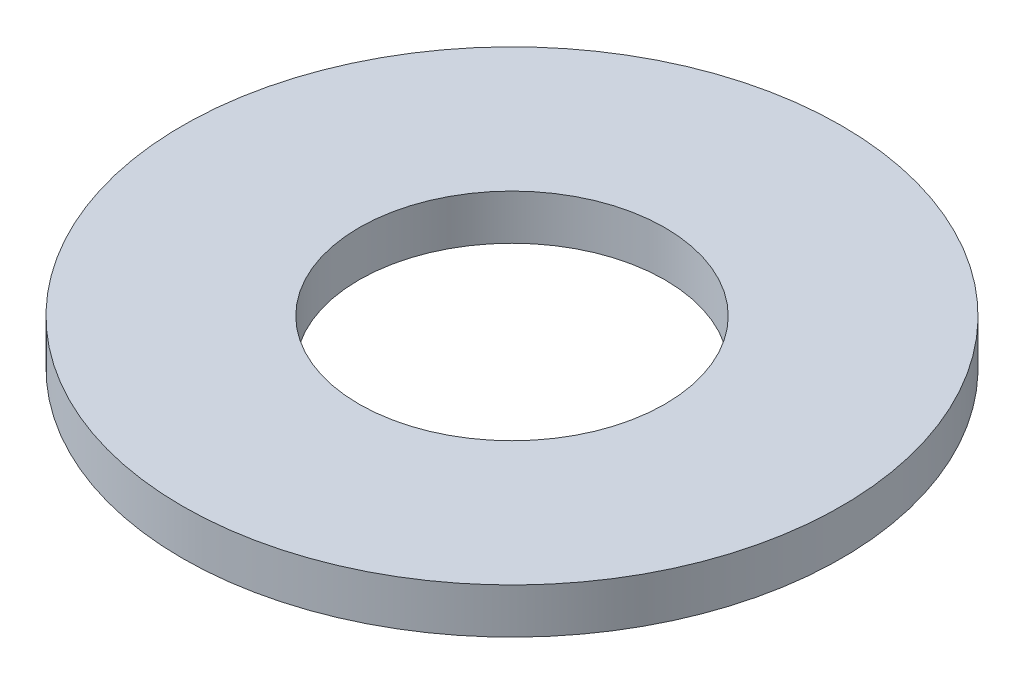
ISO-10303-21;
HEADER;
FILE_DESCRIPTION(('STEP AP214'),'2;1');
FILE_NAME('part.step','',(''),(''),'','','');
FILE_SCHEMA(('AUTOMOTIVE_DESIGN { 1 0 10303 214 1 1 1 1 }'));
ENDSEC;
DATA;
#1=APPLICATION_CONTEXT('core data for automotive mechanical design processes');
#2=APPLICATION_PROTOCOL_DEFINITION('international standard','automotive_design',2000,#1);
#3=PRODUCT_CONTEXT('',#1,'mechanical');
#4=PRODUCT('Part','Part','',(#3));
#5=PRODUCT_RELATED_PRODUCT_CATEGORY('part','',(#4));
#6=PRODUCT_DEFINITION_FORMATION('','',#4);
#7=PRODUCT_DEFINITION_CONTEXT('part definition',#1,'design');
#8=PRODUCT_DEFINITION('design','',#6,#7);
#9=PRODUCT_DEFINITION_SHAPE('','',#8);
#10=(LENGTH_UNIT() NAMED_UNIT(*) SI_UNIT(.MILLI.,.METRE.));
#11=(NAMED_UNIT(*) PLANE_ANGLE_UNIT() SI_UNIT($,.RADIAN.));
#12=(NAMED_UNIT(*) SI_UNIT($,.STERADIAN.) SOLID_ANGLE_UNIT());
#13=UNCERTAINTY_MEASURE_WITH_UNIT(LENGTH_MEASURE(1.E-05),#10,'distance_accuracy_value','');
#14=(GEOMETRIC_REPRESENTATION_CONTEXT(3) GLOBAL_UNCERTAINTY_ASSIGNED_CONTEXT((#13)) GLOBAL_UNIT_ASSIGNED_CONTEXT((#10,
#11,#12)) REPRESENTATION_CONTEXT('',''));
#15=CARTESIAN_POINT('',(0.,0.,0.));
#16=DIRECTION('',(0.,0.,1.));
#17=DIRECTION('',(1.,0.,0.));
#18=AXIS2_PLACEMENT_3D('',#15,#16,#17);
#19=CARTESIAN_POINT('',(0.,1.524,0.));
#20=DIRECTION('',(0.,-1.,0.));
#21=DIRECTION('',(0.,0.,1.));
#22=AXIS2_PLACEMENT_3D('',#19,#20,#21);
#23=CYLINDRICAL_SURFACE('',#22,11.1125);
#24=CARTESIAN_POINT('',(0.,1.524,0.));
#25=DIRECTION('',(0.,-1.,0.));
#26=DIRECTION('',(0.,0.,-1.));
#27=AXIS2_PLACEMENT_3D('',#24,#25,#26);
#28=CIRCLE('',#27,11.1125);
#29=CARTESIAN_POINT('',(0.,1.524,11.1125));
#30=VERTEX_POINT('',#29);
#31=EDGE_CURVE('E10',#30,#30,#28,.T.);
#32=CARTESIAN_POINT('',(0.,0.,0.));
#33=DIRECTION('',(0.,-1.,0.));
#34=DIRECTION('',(0.,0.,-1.));
#35=AXIS2_PLACEMENT_3D('',#32,#33,#34);
#36=CIRCLE('',#35,11.1125);
#37=CARTESIAN_POINT('',(0.,0.,11.1125));
#38=VERTEX_POINT('',#37);
#39=EDGE_CURVE('E46',#38,#38,#36,.T.);
#40=CARTESIAN_POINT('',(0.,1.524,11.1125));
#41=CARTESIAN_POINT('',(0.,1.508125,11.1125));
#42=CARTESIAN_POINT('',(0.,1.49225,11.1125));
#43=CARTESIAN_POINT('',(0.,1.4605,11.1125));
#44=CARTESIAN_POINT('',(0.,1.444625,11.1125));
#45=CARTESIAN_POINT('',(0.,1.412875,11.1125));
#46=CARTESIAN_POINT('',(0.,1.397,11.1125));
#47=CARTESIAN_POINT('',(0.,1.36525,11.1125));
#48=CARTESIAN_POINT('',(0.,1.349375,11.1125));
#49=CARTESIAN_POINT('',(0.,1.317625,11.1125));
#50=CARTESIAN_POINT('',(0.,1.30175,11.1125));
#51=CARTESIAN_POINT('',(0.,1.27,11.1125));
#52=CARTESIAN_POINT('',(0.,1.254125,11.1125));
#53=CARTESIAN_POINT('',(0.,1.222375,11.1125));
#54=CARTESIAN_POINT('',(0.,1.2065,11.1125));
#55=CARTESIAN_POINT('',(0.,1.17475,11.1125));
#56=CARTESIAN_POINT('',(0.,1.158875,11.1125));
#57=CARTESIAN_POINT('',(0.,1.127125,11.1125));
#58=CARTESIAN_POINT('',(0.,1.11125,11.1125));
#59=CARTESIAN_POINT('',(0.,1.0795,11.1125));
#60=CARTESIAN_POINT('',(0.,1.063625,11.1125));
#61=CARTESIAN_POINT('',(0.,1.031875,11.1125));
#62=CARTESIAN_POINT('',(0.,1.016,11.1125));
#63=CARTESIAN_POINT('',(0.,0.98425,11.1125));
#64=CARTESIAN_POINT('',(0.,0.968375,11.1125));
#65=CARTESIAN_POINT('',(0.,0.936625,11.1125));
#66=CARTESIAN_POINT('',(0.,0.92075,11.1125));
#67=CARTESIAN_POINT('',(0.,0.889,11.1125));
#68=CARTESIAN_POINT('',(0.,0.873125,11.1125));
#69=CARTESIAN_POINT('',(0.,0.841375,11.1125));
#70=CARTESIAN_POINT('',(0.,0.8255,11.1125));
#71=CARTESIAN_POINT('',(0.,0.79375,11.1125));
#72=CARTESIAN_POINT('',(0.,0.777875,11.1125));
#73=CARTESIAN_POINT('',(0.,0.746125,11.1125));
#74=CARTESIAN_POINT('',(0.,0.73025,11.1125));
#75=CARTESIAN_POINT('',(0.,0.6985,11.1125));
#76=CARTESIAN_POINT('',(0.,0.682625,11.1125));
#77=CARTESIAN_POINT('',(0.,0.650875,11.1125));
#78=CARTESIAN_POINT('',(0.,0.635,11.1125));
#79=CARTESIAN_POINT('',(0.,0.60325,11.1125));
#80=CARTESIAN_POINT('',(0.,0.587375,11.1125));
#81=CARTESIAN_POINT('',(0.,0.555625,11.1125));
#82=CARTESIAN_POINT('',(0.,0.53975,11.1125));
#83=CARTESIAN_POINT('',(0.,0.508,11.1125));
#84=CARTESIAN_POINT('',(0.,0.492125,11.1125));
#85=CARTESIAN_POINT('',(0.,0.460375,11.1125));
#86=CARTESIAN_POINT('',(0.,0.4445,11.1125));
#87=CARTESIAN_POINT('',(0.,0.41275,11.1125));
#88=CARTESIAN_POINT('',(0.,0.396875,11.1125));
#89=CARTESIAN_POINT('',(0.,0.365125,11.1125));
#90=CARTESIAN_POINT('',(0.,0.34925,11.1125));
#91=CARTESIAN_POINT('',(0.,0.3175,11.1125));
#92=CARTESIAN_POINT('',(0.,0.301625,11.1125));
#93=CARTESIAN_POINT('',(0.,0.269875,11.1125));
#94=CARTESIAN_POINT('',(0.,0.254,11.1125));
#95=CARTESIAN_POINT('',(0.,0.22225,11.1125));
#96=CARTESIAN_POINT('',(0.,0.206375,11.1125));
#97=CARTESIAN_POINT('',(0.,0.174625,11.1125));
#98=CARTESIAN_POINT('',(0.,0.15875,11.1125));
#99=CARTESIAN_POINT('',(0.,0.127,11.1125));
#100=CARTESIAN_POINT('',(0.,0.111125,11.1125));
#101=CARTESIAN_POINT('',(0.,0.079375,11.1125));
#102=CARTESIAN_POINT('',(0.,0.0635,11.1125));
#103=CARTESIAN_POINT('',(0.,0.0317499999999999,11.1125));
#104=CARTESIAN_POINT('',(0.,0.015875,11.1125));
#105=CARTESIAN_POINT('',(0.,0.,11.1125));
#106=B_SPLINE_CURVE_WITH_KNOTS('',3,(#40,#41,#42,#43,#44,#45,#46,#47,#48,#49,#50,#51,#52,#53,
#54,#55,#56,#57,#58,#59,#60,#61,#62,#63,#64,#65,#66,#67,#68,#69,#70,#71,#72,#73,#74,#75,#76,#77,
#78,#79,#80,#81,#82,#83,#84,#85,#86,#87,#88,#89,#90,#91,#92,#93,#94,#95,#96,#97,#98,#99,#100,
#101,#102,#103,#104,#105),.UNSPECIFIED.,.F.,.F.,(4,2,2,2,2,2,2,2,2,2,2,2,2,2,2,2,2,2,2,2,2,2,2,
2,2,2,2,2,2,2,2,2,4),(0.,0.0476249999999999,0.0952499999999998,0.142875,0.1905,0.238125,0.28575,
0.333375,0.381,0.428625,0.47625,0.523875,0.5715,0.619125,0.66675,0.714375,0.762,0.809625,
0.85725,0.904875,0.9525,1.000125,1.04775,1.095375,1.143,1.190625,1.23825,1.285875,1.3335,
1.381125,1.42875,1.476375,1.524),.UNSPECIFIED.);
#107=EDGE_CURVE('BSEAM43',#30,#38,#106,.T.);
#108=ORIENTED_EDGE('',*,*,#31,.T.);
#109=ORIENTED_EDGE('',*,*,#39,.F.);
#110=ORIENTED_EDGE('',*,*,#107,.T.);
#111=ORIENTED_EDGE('',*,*,#107,.F.);
#112=EDGE_LOOP('',(#108,#110,#109,#111));
#113=FACE_BOUND('',#112,.T.);
#114=ADVANCED_FACE('F43',(#113),#23,.T.);
#115=CARTESIAN_POINT('',(0.,1.524,0.));
#116=DIRECTION('',(0.,1.,0.));
#117=DIRECTION('',(0.,0.,-1.));
#118=AXIS2_PLACEMENT_3D('',#115,#116,#117);
#119=PLANE('',#118);
#120=CARTESIAN_POINT('',(0.,1.524,0.));
#121=DIRECTION('',(0.,-1.,0.));
#122=DIRECTION('',(0.,0.,-1.));
#123=AXIS2_PLACEMENT_3D('',#120,#121,#122);
#124=CIRCLE('',#123,5.1562);
#125=CARTESIAN_POINT('',(0.,1.524,-5.1562));
#126=VERTEX_POINT('',#125);
#127=EDGE_CURVE('E55',#126,#126,#124,.T.);
#128=ORIENTED_EDGE('',*,*,#127,.T.);
#129=EDGE_LOOP('',(#128));
#130=FACE_BOUND('',#129,.T.);
#131=ORIENTED_EDGE('',*,*,#31,.F.);
#132=EDGE_LOOP('',(#131));
#133=FACE_BOUND('',#132,.T.);
#134=ADVANCED_FACE('F67',(#130,#133),#119,.T.);
#135=CARTESIAN_POINT('',(0.,0.,0.));
#136=DIRECTION('',(0.,1.,0.));
#137=DIRECTION('',(0.,0.,-1.));
#138=AXIS2_PLACEMENT_3D('',#135,#136,#137);
#139=PLANE('',#138);
#140=CARTESIAN_POINT('',(0.,0.,0.));
#141=DIRECTION('',(0.,-1.,0.));
#142=DIRECTION('',(0.,0.,-1.));
#143=AXIS2_PLACEMENT_3D('',#140,#141,#142);
#144=CIRCLE('',#143,5.1562);
#145=CARTESIAN_POINT('',(0.,0.,-5.1562));
#146=VERTEX_POINT('',#145);
#147=EDGE_CURVE('E53',#146,#146,#144,.T.);
#148=ORIENTED_EDGE('',*,*,#147,.F.);
#149=EDGE_LOOP('',(#148));
#150=FACE_BOUND('',#149,.T.);
#151=ORIENTED_EDGE('',*,*,#39,.T.);
#152=EDGE_LOOP('',(#151));
#153=FACE_BOUND('',#152,.T.);
#154=ADVANCED_FACE('F64',(#150,#153),#139,.F.);
#155=CARTESIAN_POINT('',(0.,0.,0.));
#156=DIRECTION('',(0.,1.,0.));
#157=DIRECTION('',(0.,0.,-1.));
#158=AXIS2_PLACEMENT_3D('',#155,#156,#157);
#159=CYLINDRICAL_SURFACE('',#158,5.1562);
#160=CARTESIAN_POINT('',(0.,0.,-5.1562));
#161=CARTESIAN_POINT('',(0.,0.015875,-5.1562));
#162=CARTESIAN_POINT('',(0.,0.03175,-5.1562));
#163=CARTESIAN_POINT('',(0.,0.0635,-5.1562));
#164=CARTESIAN_POINT('',(0.,0.079375,-5.1562));
#165=CARTESIAN_POINT('',(0.,0.111125,-5.1562));
#166=CARTESIAN_POINT('',(0.,0.127,-5.1562));
#167=CARTESIAN_POINT('',(0.,0.15875,-5.1562));
#168=CARTESIAN_POINT('',(0.,0.174625,-5.1562));
#169=CARTESIAN_POINT('',(0.,0.206375,-5.1562));
#170=CARTESIAN_POINT('',(0.,0.22225,-5.1562));
#171=CARTESIAN_POINT('',(0.,0.254,-5.1562));
#172=CARTESIAN_POINT('',(0.,0.269875,-5.1562));
#173=CARTESIAN_POINT('',(0.,0.301625,-5.1562));
#174=CARTESIAN_POINT('',(0.,0.3175,-5.1562));
#175=CARTESIAN_POINT('',(0.,0.34925,-5.1562));
#176=CARTESIAN_POINT('',(0.,0.365125,-5.1562));
#177=CARTESIAN_POINT('',(0.,0.396875,-5.1562));
#178=CARTESIAN_POINT('',(0.,0.41275,-5.1562));
#179=CARTESIAN_POINT('',(0.,0.4445,-5.1562));
#180=CARTESIAN_POINT('',(0.,0.460375,-5.1562));
#181=CARTESIAN_POINT('',(0.,0.492125,-5.1562));
#182=CARTESIAN_POINT('',(0.,0.508,-5.1562));
#183=CARTESIAN_POINT('',(0.,0.53975,-5.1562));
#184=CARTESIAN_POINT('',(0.,0.555625,-5.1562));
#185=CARTESIAN_POINT('',(0.,0.587375,-5.1562));
#186=CARTESIAN_POINT('',(0.,0.60325,-5.1562));
#187=CARTESIAN_POINT('',(0.,0.635,-5.1562));
#188=CARTESIAN_POINT('',(0.,0.650875,-5.1562));
#189=CARTESIAN_POINT('',(0.,0.682625,-5.1562));
#190=CARTESIAN_POINT('',(0.,0.6985,-5.1562));
#191=CARTESIAN_POINT('',(0.,0.73025,-5.1562));
#192=CARTESIAN_POINT('',(0.,0.746125,-5.1562));
#193=CARTESIAN_POINT('',(0.,0.777875,-5.1562));
#194=CARTESIAN_POINT('',(0.,0.79375,-5.1562));
#195=CARTESIAN_POINT('',(0.,0.8255,-5.1562));
#196=CARTESIAN_POINT('',(0.,0.841375,-5.1562));
#197=CARTESIAN_POINT('',(0.,0.873125,-5.1562));
#198=CARTESIAN_POINT('',(0.,0.889,-5.1562));
#199=CARTESIAN_POINT('',(0.,0.92075,-5.1562));
#200=CARTESIAN_POINT('',(0.,0.936625,-5.1562));
#201=CARTESIAN_POINT('',(0.,0.968375,-5.1562));
#202=CARTESIAN_POINT('',(0.,0.98425,-5.1562));
#203=CARTESIAN_POINT('',(0.,1.016,-5.1562));
#204=CARTESIAN_POINT('',(0.,1.031875,-5.1562));
#205=CARTESIAN_POINT('',(0.,1.063625,-5.1562));
#206=CARTESIAN_POINT('',(0.,1.0795,-5.1562));
#207=CARTESIAN_POINT('',(0.,1.11125,-5.1562));
#208=CARTESIAN_POINT('',(0.,1.127125,-5.1562));
#209=CARTESIAN_POINT('',(0.,1.158875,-5.1562));
#210=CARTESIAN_POINT('',(0.,1.17475,-5.1562));
#211=CARTESIAN_POINT('',(0.,1.2065,-5.1562));
#212=CARTESIAN_POINT('',(0.,1.222375,-5.1562));
#213=CARTESIAN_POINT('',(0.,1.254125,-5.1562));
#214=CARTESIAN_POINT('',(0.,1.27,-5.1562));
#215=CARTESIAN_POINT('',(0.,1.30175,-5.1562));
#216=CARTESIAN_POINT('',(0.,1.317625,-5.1562));
#217=CARTESIAN_POINT('',(0.,1.349375,-5.1562));
#218=CARTESIAN_POINT('',(0.,1.36525,-5.1562));
#219=CARTESIAN_POINT('',(0.,1.397,-5.1562));
#220=CARTESIAN_POINT('',(0.,1.412875,-5.1562));
#221=CARTESIAN_POINT('',(0.,1.444625,-5.1562));
#222=CARTESIAN_POINT('',(0.,1.4605,-5.1562));
#223=CARTESIAN_POINT('',(0.,1.49225,-5.1562));
#224=CARTESIAN_POINT('',(0.,1.508125,-5.1562));
#225=CARTESIAN_POINT('',(0.,1.524,-5.1562));
#226=B_SPLINE_CURVE_WITH_KNOTS('',3,(#160,#161,#162,#163,#164,#165,#166,#167,#168,#169,#170,
#171,#172,#173,#174,#175,#176,#177,#178,#179,#180,#181,#182,#183,#184,#185,#186,#187,#188,#189,
#190,#191,#192,#193,#194,#195,#196,#197,#198,#199,#200,#201,#202,#203,#204,#205,#206,#207,#208,
#209,#210,#211,#212,#213,#214,#215,#216,#217,#218,#219,#220,#221,#222,#223,#224,#225),
.UNSPECIFIED.,.F.,.F.,(4,2,2,2,2,2,2,2,2,2,2,2,2,2,2,2,2,2,2,2,2,2,2,2,2,2,2,2,2,2,2,2,4),(0.,
0.047625,0.09525,0.142875,0.1905,0.238125,0.28575,0.333375,0.381,0.428625,0.47625,0.523875,
0.5715,0.619125,0.66675,0.714375,0.762,0.809625,0.85725,0.904875,0.9525,1.000125,1.04775,
1.095375,1.143,1.190625,1.23825,1.285875,1.3335,1.381125,1.42875,1.476375,1.524),.UNSPECIFIED.);
#227=EDGE_CURVE('BSEAM61',#146,#126,#226,.T.);
#228=ORIENTED_EDGE('',*,*,#147,.T.);
#229=ORIENTED_EDGE('',*,*,#127,.F.);
#230=ORIENTED_EDGE('',*,*,#227,.T.);
#231=ORIENTED_EDGE('',*,*,#227,.F.);
#232=EDGE_LOOP('',(#228,#230,#229,#231));
#233=FACE_BOUND('',#232,.T.);
#234=ADVANCED_FACE('F61',(#233),#159,.F.);
#235=CLOSED_SHELL('',(#114,#134,#154,#234));
#236=MANIFOLD_SOLID_BREP('B2',#235);
#237=ADVANCED_BREP_SHAPE_REPRESENTATION('',(#18,#236),#14);
#238=SHAPE_DEFINITION_REPRESENTATION(#9,#237);
ENDSEC;
END-ISO-10303-21;
